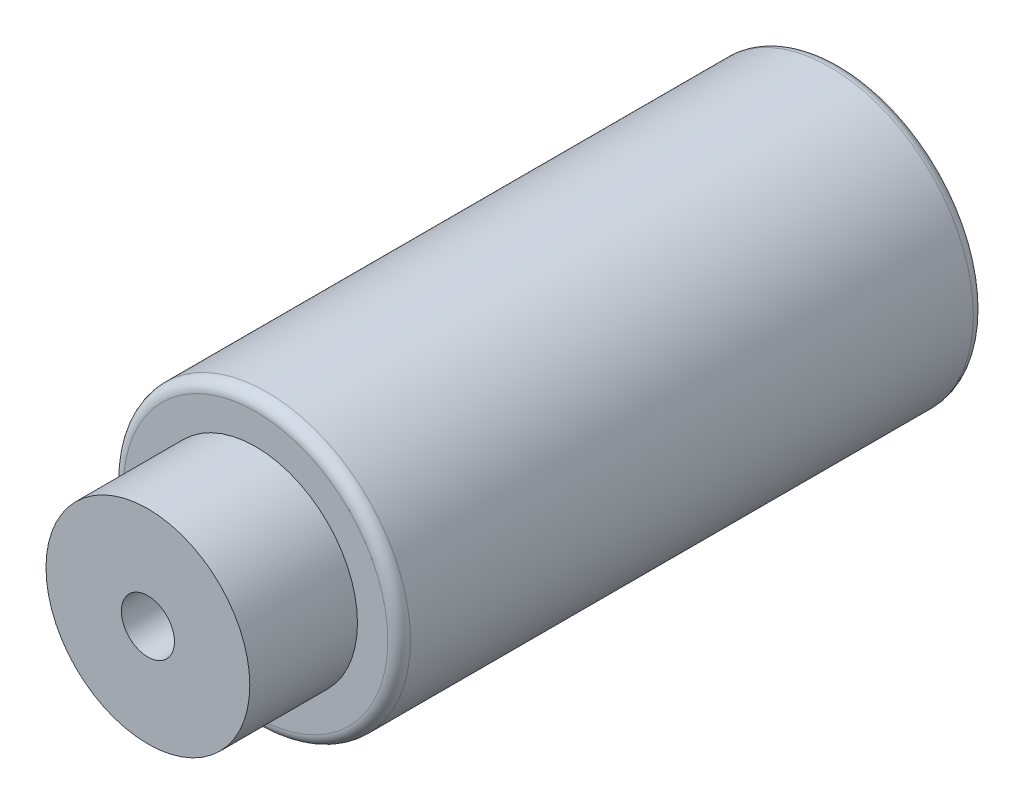
ISO-10303-21;
HEADER;
FILE_DESCRIPTION(('STEP AP214'),'2;1');
FILE_NAME('part.step','',(''),(''),'','','');
FILE_SCHEMA(('AUTOMOTIVE_DESIGN { 1 0 10303 214 1 1 1 1 }'));
ENDSEC;
DATA;
#1=APPLICATION_CONTEXT('core data for automotive mechanical design processes');
#2=APPLICATION_PROTOCOL_DEFINITION('international standard','automotive_design',2000,#1);
#3=PRODUCT_CONTEXT('',#1,'mechanical');
#4=PRODUCT('Part','Part','',(#3));
#5=PRODUCT_RELATED_PRODUCT_CATEGORY('part','',(#4));
#6=PRODUCT_DEFINITION_FORMATION('','',#4);
#7=PRODUCT_DEFINITION_CONTEXT('part definition',#1,'design');
#8=PRODUCT_DEFINITION('design','',#6,#7);
#9=PRODUCT_DEFINITION_SHAPE('','',#8);
#10=(LENGTH_UNIT() NAMED_UNIT(*) SI_UNIT(.MILLI.,.METRE.));
#11=(NAMED_UNIT(*) PLANE_ANGLE_UNIT() SI_UNIT($,.RADIAN.));
#12=(NAMED_UNIT(*) SI_UNIT($,.STERADIAN.) SOLID_ANGLE_UNIT());
#13=UNCERTAINTY_MEASURE_WITH_UNIT(LENGTH_MEASURE(1.E-05),#10,'distance_accuracy_value','');
#14=(GEOMETRIC_REPRESENTATION_CONTEXT(3) GLOBAL_UNCERTAINTY_ASSIGNED_CONTEXT((#13)) GLOBAL_UNIT_ASSIGNED_CONTEXT((#10,
#11,#12)) REPRESENTATION_CONTEXT('',''));
#15=CARTESIAN_POINT('',(0.,0.,0.));
#16=DIRECTION('',(0.,0.,1.));
#17=DIRECTION('',(1.,0.,0.));
#18=AXIS2_PLACEMENT_3D('',#15,#16,#17);
#19=CARTESIAN_POINT('',(0.,0.,51.816));
#20=DIRECTION('',(0.,0.,-1.));
#21=DIRECTION('',(-1.,0.,0.));
#22=AXIS2_PLACEMENT_3D('',#19,#20,#21);
#23=CYLINDRICAL_SURFACE('',#22,12.7);
#24=CARTESIAN_POINT('',(0.,0.,50.816));
#25=DIRECTION('',(0.,0.,1.));
#26=DIRECTION('',(1.,0.,0.));
#27=AXIS2_PLACEMENT_3D('',#24,#25,#26);
#28=CIRCLE('',#27,12.7);
#29=CARTESIAN_POINT('',(12.7,0.,50.816));
#30=VERTEX_POINT('',#29);
#31=EDGE_CURVE('E40',#30,#30,#28,.F.);
#32=ORIENTED_EDGE('',*,*,#31,.T.);
#33=EDGE_LOOP('',(#32));
#34=FACE_BOUND('',#33,.T.);
#35=CARTESIAN_POINT('',(0.,0.,1.));
#36=DIRECTION('',(0.,0.,1.));
#37=DIRECTION('',(1.,0.,0.));
#38=AXIS2_PLACEMENT_3D('',#35,#36,#37);
#39=CIRCLE('',#38,12.7);
#40=CARTESIAN_POINT('',(12.7,0.,1.));
#41=VERTEX_POINT('',#40);
#42=EDGE_CURVE('E44',#41,#41,#39,.T.);
#43=ORIENTED_EDGE('',*,*,#42,.T.);
#44=EDGE_LOOP('',(#43));
#45=FACE_BOUND('',#44,.T.);
#46=ADVANCED_FACE('F32',(#34,#45),#23,.T.);
#47=CARTESIAN_POINT('',(0.,0.,51.816));
#48=DIRECTION('',(0.,0.,1.));
#49=DIRECTION('',(1.,0.,0.));
#50=AXIS2_PLACEMENT_3D('',#47,#48,#49);
#51=PLANE('',#50);
#52=CARTESIAN_POINT('',(0.,0.,51.816));
#53=DIRECTION('',(0.,0.,1.));
#54=DIRECTION('',(1.,0.,0.));
#55=AXIS2_PLACEMENT_3D('',#52,#53,#54);
#56=CIRCLE('',#55,9.017);
#57=CARTESIAN_POINT('',(9.017,0.,51.816));
#58=VERTEX_POINT('',#57);
#59=EDGE_CURVE('E53',#58,#58,#56,.T.);
#60=ORIENTED_EDGE('',*,*,#59,.F.);
#61=EDGE_LOOP('',(#60));
#62=FACE_BOUND('',#61,.T.);
#63=CARTESIAN_POINT('',(0.,0.,51.816));
#64=DIRECTION('',(0.,0.,1.));
#65=DIRECTION('',(1.,0.,0.));
#66=AXIS2_PLACEMENT_3D('',#63,#64,#65);
#67=CIRCLE('',#66,11.7);
#68=CARTESIAN_POINT('',(11.7,0.,51.816));
#69=VERTEX_POINT('',#68);
#70=EDGE_CURVE('E49',#69,#69,#67,.T.);
#71=ORIENTED_EDGE('',*,*,#70,.T.);
#72=EDGE_LOOP('',(#71));
#73=FACE_BOUND('',#72,.T.);
#74=ADVANCED_FACE('F89',(#62,#73),#51,.T.);
#75=CARTESIAN_POINT('',(0.,0.,0.));
#76=DIRECTION('',(0.,0.,1.));
#77=DIRECTION('',(1.,0.,0.));
#78=AXIS2_PLACEMENT_3D('',#75,#76,#77);
#79=PLANE('',#78);
#80=CARTESIAN_POINT('',(0.,0.,0.));
#81=DIRECTION('',(0.,0.,-1.));
#82=DIRECTION('',(-1.,0.,0.));
#83=AXIS2_PLACEMENT_3D('',#80,#81,#82);
#84=CIRCLE('',#83,5.4991);
#85=CARTESIAN_POINT('',(-5.4991,0.,0.));
#86=VERTEX_POINT('',#85);
#87=EDGE_CURVE('E59',#86,#86,#84,.T.);
#88=ORIENTED_EDGE('',*,*,#87,.F.);
#89=EDGE_LOOP('',(#88));
#90=FACE_BOUND('',#89,.T.);
#91=CARTESIAN_POINT('',(0.,0.,0.));
#92=DIRECTION('',(0.,0.,1.));
#93=DIRECTION('',(1.,0.,0.));
#94=AXIS2_PLACEMENT_3D('',#91,#92,#93);
#95=CIRCLE('',#94,11.7);
#96=CARTESIAN_POINT('',(11.7,0.,0.));
#97=VERTEX_POINT('',#96);
#98=EDGE_CURVE('E10',#97,#97,#95,.F.);
#99=ORIENTED_EDGE('',*,*,#98,.T.);
#100=EDGE_LOOP('',(#99));
#101=FACE_BOUND('',#100,.T.);
#102=ADVANCED_FACE('F86',(#90,#101),#79,.F.);
#103=CARTESIAN_POINT('',(0.,0.,50.816));
#104=DIRECTION('',(0.,0.,1.));
#105=DIRECTION('',(1.,0.,0.));
#106=AXIS2_PLACEMENT_3D('',#103,#104,#105);
#107=TOROIDAL_SURFACE('',#106,11.7,1.);
#108=ORIENTED_EDGE('',*,*,#31,.F.);
#109=EDGE_LOOP('',(#108));
#110=FACE_BOUND('',#109,.T.);
#111=ORIENTED_EDGE('',*,*,#70,.F.);
#112=EDGE_LOOP('',(#111));
#113=FACE_BOUND('',#112,.T.);
#114=ADVANCED_FACE('F88',(#110,#113),#107,.T.);
#115=CARTESIAN_POINT('',(0.,0.,1.));
#116=DIRECTION('',(0.,0.,1.));
#117=DIRECTION('',(1.,0.,0.));
#118=AXIS2_PLACEMENT_3D('',#115,#116,#117);
#119=TOROIDAL_SURFACE('',#118,11.7,1.);
#120=ORIENTED_EDGE('',*,*,#98,.F.);
#121=EDGE_LOOP('',(#120));
#122=FACE_BOUND('',#121,.T.);
#123=ORIENTED_EDGE('',*,*,#42,.F.);
#124=EDGE_LOOP('',(#123));
#125=FACE_BOUND('',#124,.T.);
#126=ADVANCED_FACE('F34',(#122,#125),#119,.T.);
#127=CARTESIAN_POINT('',(0.,0.,61.346));
#128=DIRECTION('',(0.,0.,-1.));
#129=DIRECTION('',(-1.,0.,0.));
#130=AXIS2_PLACEMENT_3D('',#127,#128,#129);
#131=CYLINDRICAL_SURFACE('',#130,9.017);
#132=CARTESIAN_POINT('',(0.,0.,61.346));
#133=DIRECTION('',(0.,0.,1.));
#134=DIRECTION('',(1.,0.,0.));
#135=AXIS2_PLACEMENT_3D('',#132,#133,#134);
#136=CIRCLE('',#135,9.017);
#137=CARTESIAN_POINT('',(9.017,0.,61.346));
#138=VERTEX_POINT('',#137);
#139=EDGE_CURVE('E52',#138,#138,#136,.T.);
#140=ORIENTED_EDGE('',*,*,#139,.F.);
#141=EDGE_LOOP('',(#140));
#142=FACE_BOUND('',#141,.T.);
#143=ORIENTED_EDGE('',*,*,#59,.T.);
#144=EDGE_LOOP('',(#143));
#145=FACE_BOUND('',#144,.T.);
#146=ADVANCED_FACE('F108',(#142,#145),#131,.T.);
#147=CARTESIAN_POINT('',(0.,0.,61.346));
#148=DIRECTION('',(0.,0.,1.));
#149=DIRECTION('',(1.,0.,0.));
#150=AXIS2_PLACEMENT_3D('',#147,#148,#149);
#151=PLANE('',#150);
#152=CARTESIAN_POINT('',(0.,0.,61.346));
#153=DIRECTION('',(0.,0.,1.));
#154=DIRECTION('',(1.,0.,0.));
#155=AXIS2_PLACEMENT_3D('',#152,#153,#154);
#156=CIRCLE('',#155,2.3495);
#157=CARTESIAN_POINT('',(2.3495,0.,61.346));
#158=VERTEX_POINT('',#157);
#159=EDGE_CURVE('E64',#158,#158,#156,.T.);
#160=ORIENTED_EDGE('',*,*,#159,.F.);
#161=EDGE_LOOP('',(#160));
#162=FACE_BOUND('',#161,.T.);
#163=ORIENTED_EDGE('',*,*,#139,.T.);
#164=EDGE_LOOP('',(#163));
#165=FACE_BOUND('',#164,.T.);
#166=ADVANCED_FACE('F82',(#162,#165),#151,.T.);
#167=CARTESIAN_POINT('',(0.,0.,50.8));
#168=DIRECTION('',(0.,0.,-1.));
#169=DIRECTION('',(-1.,0.,0.));
#170=AXIS2_PLACEMENT_3D('',#167,#168,#169);
#171=CYLINDRICAL_SURFACE('',#170,5.4991);
#172=CARTESIAN_POINT('',(0.,0.,50.8));
#173=DIRECTION('',(0.,0.,-1.));
#174=DIRECTION('',(-1.,0.,0.));
#175=AXIS2_PLACEMENT_3D('',#172,#173,#174);
#176=CIRCLE('',#175,5.4991);
#177=CARTESIAN_POINT('',(-5.4991,0.,50.8));
#178=VERTEX_POINT('',#177);
#179=EDGE_CURVE('E56',#178,#178,#176,.T.);
#180=ORIENTED_EDGE('',*,*,#179,.F.);
#181=EDGE_LOOP('',(#180));
#182=FACE_BOUND('',#181,.T.);
#183=ORIENTED_EDGE('',*,*,#87,.T.);
#184=EDGE_LOOP('',(#183));
#185=FACE_BOUND('',#184,.T.);
#186=ADVANCED_FACE('F76',(#182,#185),#171,.F.);
#187=CARTESIAN_POINT('',(0.,0.,50.8));
#188=DIRECTION('',(0.,0.,-1.));
#189=DIRECTION('',(-1.,0.,0.));
#190=AXIS2_PLACEMENT_3D('',#187,#188,#189);
#191=PLANE('',#190);
#192=CARTESIAN_POINT('',(0.,0.,50.8));
#193=DIRECTION('',(0.,0.,-1.));
#194=DIRECTION('',(-1.,0.,0.));
#195=AXIS2_PLACEMENT_3D('',#192,#193,#194);
#196=CIRCLE('',#195,2.3495);
#197=CARTESIAN_POINT('',(-2.3495,0.,50.8));
#198=VERTEX_POINT('',#197);
#199=EDGE_CURVE('E36',#198,#198,#196,.T.);
#200=ORIENTED_EDGE('',*,*,#199,.F.);
#201=EDGE_LOOP('',(#200));
#202=FACE_BOUND('',#201,.T.);
#203=ORIENTED_EDGE('',*,*,#179,.T.);
#204=EDGE_LOOP('',(#203));
#205=FACE_BOUND('',#204,.T.);
#206=ADVANCED_FACE('F73',(#202,#205),#191,.T.);
#207=CARTESIAN_POINT('',(0.,0.,10.546));
#208=DIRECTION('',(0.,0.,1.));
#209=DIRECTION('',(1.,0.,0.));
#210=AXIS2_PLACEMENT_3D('',#207,#208,#209);
#211=CYLINDRICAL_SURFACE('',#210,2.3495);
#212=ORIENTED_EDGE('',*,*,#199,.T.);
#213=EDGE_LOOP('',(#212));
#214=FACE_BOUND('',#213,.T.);
#215=ORIENTED_EDGE('',*,*,#159,.T.);
#216=EDGE_LOOP('',(#215));
#217=FACE_BOUND('',#216,.T.);
#218=ADVANCED_FACE('F71',(#214,#217),#211,.F.);
#219=CLOSED_SHELL('',(#46,#74,#102,#114,#126,#146,#166,#186,#206,#218));
#220=MANIFOLD_SOLID_BREP('B2',#219);
#221=ADVANCED_BREP_SHAPE_REPRESENTATION('',(#18,#220),#14);
#222=SHAPE_DEFINITION_REPRESENTATION(#9,#221);
ENDSEC;
END-ISO-10303-21;
